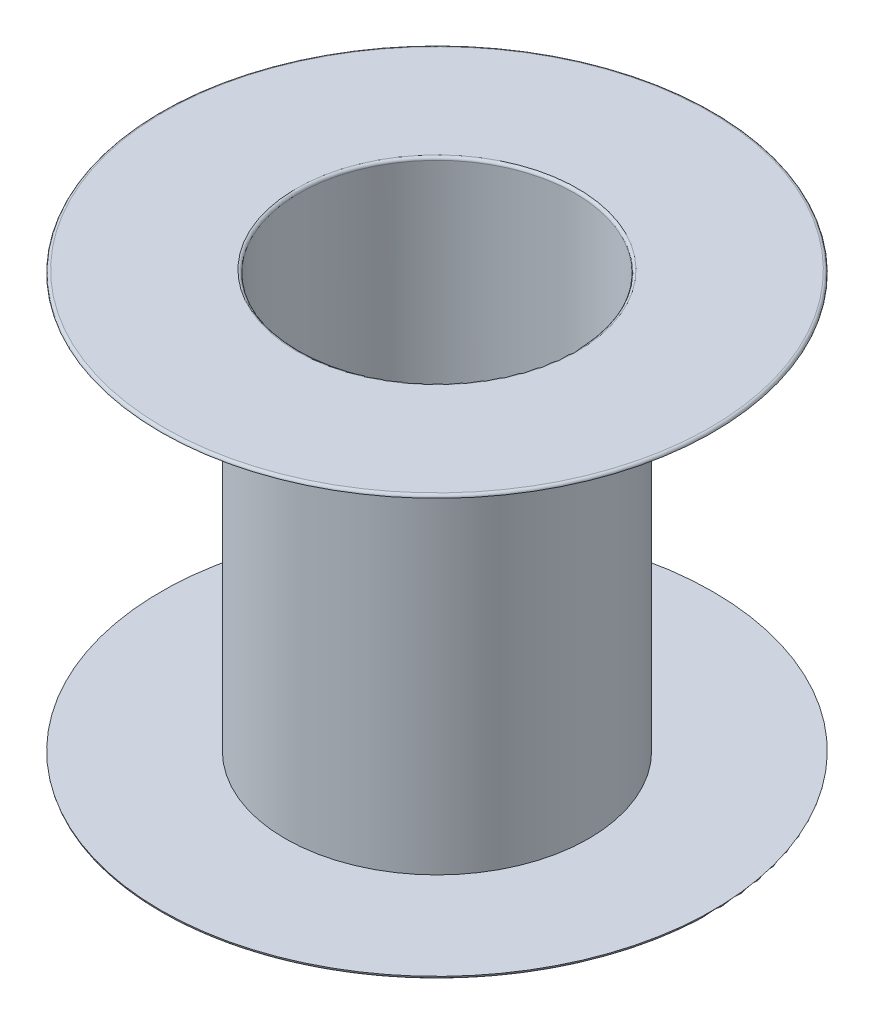
ISO-10303-21;
HEADER;
FILE_DESCRIPTION(('STEP AP214'),'2;1');
FILE_NAME('part.step','',(''),(''),'','','');
FILE_SCHEMA(('AUTOMOTIVE_DESIGN { 1 0 10303 214 1 1 1 1 }'));
ENDSEC;
DATA;
#1=APPLICATION_CONTEXT('core data for automotive mechanical design processes');
#2=APPLICATION_PROTOCOL_DEFINITION('international standard','automotive_design',2000,#1);
#3=PRODUCT_CONTEXT('',#1,'mechanical');
#4=PRODUCT('Part','Part','',(#3));
#5=PRODUCT_RELATED_PRODUCT_CATEGORY('part','',(#4));
#6=PRODUCT_DEFINITION_FORMATION('','',#4);
#7=PRODUCT_DEFINITION_CONTEXT('part definition',#1,'design');
#8=PRODUCT_DEFINITION('design','',#6,#7);
#9=PRODUCT_DEFINITION_SHAPE('','',#8);
#10=(LENGTH_UNIT() NAMED_UNIT(*) SI_UNIT(.MILLI.,.METRE.));
#11=(NAMED_UNIT(*) PLANE_ANGLE_UNIT() SI_UNIT($,.RADIAN.));
#12=(NAMED_UNIT(*) SI_UNIT($,.STERADIAN.) SOLID_ANGLE_UNIT());
#13=UNCERTAINTY_MEASURE_WITH_UNIT(LENGTH_MEASURE(1.E-05),#10,'distance_accuracy_value','');
#14=(GEOMETRIC_REPRESENTATION_CONTEXT(3) GLOBAL_UNCERTAINTY_ASSIGNED_CONTEXT((#13)) GLOBAL_UNIT_ASSIGNED_CONTEXT((#10,
#11,#12)) REPRESENTATION_CONTEXT('',''));
#15=CARTESIAN_POINT('',(0.,0.,0.));
#16=DIRECTION('',(0.,0.,1.));
#17=DIRECTION('',(1.,0.,0.));
#18=AXIS2_PLACEMENT_3D('',#15,#16,#17);
#19=CARTESIAN_POINT('',(0.,1.5,0.));
#20=DIRECTION('',(0.,-1.,0.));
#21=DIRECTION('',(0.,0.,-1.));
#22=AXIS2_PLACEMENT_3D('',#19,#20,#21);
#23=CYLINDRICAL_SURFACE('',#22,0.55);
#24=CARTESIAN_POINT('',(0.,1.5,0.));
#25=DIRECTION('',(0.,1.,0.));
#26=DIRECTION('',(0.,0.,1.));
#27=AXIS2_PLACEMENT_3D('',#24,#25,#26);
#28=CIRCLE('',#27,0.55);
#29=CARTESIAN_POINT('',(0.,1.5,0.55));
#30=VERTEX_POINT('',#29);
#31=EDGE_CURVE('E57',#30,#30,#28,.T.);
#32=ORIENTED_EDGE('',*,*,#31,.F.);
#33=EDGE_LOOP('',(#32));
#34=FACE_BOUND('',#33,.T.);
#35=CARTESIAN_POINT('',(0.,0.,0.));
#36=DIRECTION('',(0.,-1.,0.));
#37=DIRECTION('',(0.,0.,-1.));
#38=AXIS2_PLACEMENT_3D('',#35,#36,#37);
#39=CIRCLE('',#38,0.55);
#40=CARTESIAN_POINT('',(0.,0.,-0.55));
#41=VERTEX_POINT('',#40);
#42=EDGE_CURVE('E63',#41,#41,#39,.T.);
#43=ORIENTED_EDGE('',*,*,#42,.F.);
#44=EDGE_LOOP('',(#43));
#45=FACE_BOUND('',#44,.T.);
#46=ADVANCED_FACE('F31',(#34,#45),#23,.T.);
#47=CARTESIAN_POINT('',(0.,1.5,0.));
#48=DIRECTION('',(0.,-1.,0.));
#49=DIRECTION('',(0.,0.,-1.));
#50=AXIS2_PLACEMENT_3D('',#47,#48,#49);
#51=CYLINDRICAL_SURFACE('',#50,0.5);
#52=CARTESIAN_POINT('',(0.,0.,0.));
#53=DIRECTION('',(0.,-1.,0.));
#54=DIRECTION('',(0.,0.,-1.));
#55=AXIS2_PLACEMENT_3D('',#52,#53,#54);
#56=CIRCLE('',#55,0.5);
#57=CARTESIAN_POINT('',(0.,0.,-0.5));
#58=VERTEX_POINT('',#57);
#59=EDGE_CURVE('E10',#58,#58,#56,.T.);
#60=ORIENTED_EDGE('',*,*,#59,.T.);
#61=EDGE_LOOP('',(#60));
#62=FACE_BOUND('',#61,.T.);
#63=CARTESIAN_POINT('',(0.,1.5,0.));
#64=DIRECTION('',(0.,1.,0.));
#65=DIRECTION('',(0.,0.,1.));
#66=AXIS2_PLACEMENT_3D('',#63,#64,#65);
#67=CIRCLE('',#66,0.5);
#68=CARTESIAN_POINT('',(0.,1.5,0.5));
#69=VERTEX_POINT('',#68);
#70=EDGE_CURVE('E54',#69,#69,#67,.T.);
#71=ORIENTED_EDGE('',*,*,#70,.T.);
#72=EDGE_LOOP('',(#71));
#73=FACE_BOUND('',#72,.T.);
#74=ADVANCED_FACE('F85',(#62,#73),#51,.F.);
#75=CARTESIAN_POINT('',(0.,1.5,0.));
#76=DIRECTION('',(0.,1.,0.));
#77=DIRECTION('',(0.,0.,1.));
#78=AXIS2_PLACEMENT_3D('',#75,#76,#77);
#79=PLANE('',#78);
#80=CARTESIAN_POINT('',(0.,1.5,0.));
#81=DIRECTION('',(0.,1.,0.));
#82=DIRECTION('',(0.,0.,1.));
#83=AXIS2_PLACEMENT_3D('',#80,#81,#82);
#84=CIRCLE('',#83,1.);
#85=CARTESIAN_POINT('',(0.,1.5,1.));
#86=VERTEX_POINT('',#85);
#87=EDGE_CURVE('E60',#86,#86,#84,.T.);
#88=ORIENTED_EDGE('',*,*,#87,.F.);
#89=EDGE_LOOP('',(#88));
#90=FACE_BOUND('',#89,.T.);
#91=ORIENTED_EDGE('',*,*,#31,.T.);
#92=EDGE_LOOP('',(#91));
#93=FACE_BOUND('',#92,.T.);
#94=ADVANCED_FACE('F91',(#90,#93),#79,.F.);
#95=CARTESIAN_POINT('',(0.,1.51,0.));
#96=DIRECTION('',(0.,1.,0.));
#97=DIRECTION('',(0.,0.,1.));
#98=AXIS2_PLACEMENT_3D('',#95,#96,#97);
#99=PLANE('',#98);
#100=CARTESIAN_POINT('',(0.,1.51,0.));
#101=DIRECTION('',(0.,1.,0.));
#102=DIRECTION('',(0.,0.,1.));
#103=AXIS2_PLACEMENT_3D('',#100,#101,#102);
#104=CIRCLE('',#103,0.51);
#105=CARTESIAN_POINT('',(0.,1.51,0.51));
#106=VERTEX_POINT('',#105);
#107=EDGE_CURVE('E46',#106,#106,#104,.F.);
#108=ORIENTED_EDGE('',*,*,#107,.T.);
#109=EDGE_LOOP('',(#108));
#110=FACE_BOUND('',#109,.T.);
#111=CARTESIAN_POINT('',(0.,1.51,0.));
#112=DIRECTION('',(0.,1.,0.));
#113=DIRECTION('',(0.,0.,1.));
#114=AXIS2_PLACEMENT_3D('',#111,#112,#113);
#115=CIRCLE('',#114,0.99);
#116=CARTESIAN_POINT('',(0.,1.51,0.99));
#117=VERTEX_POINT('',#116);
#118=EDGE_CURVE('E51',#117,#117,#115,.T.);
#119=ORIENTED_EDGE('',*,*,#118,.T.);
#120=EDGE_LOOP('',(#119));
#121=FACE_BOUND('',#120,.T.);
#122=ADVANCED_FACE('F100',(#110,#121),#99,.T.);
#123=CARTESIAN_POINT('',(0.,1.5,0.));
#124=DIRECTION('',(0.,1.,0.));
#125=DIRECTION('',(0.,0.,1.));
#126=AXIS2_PLACEMENT_3D('',#123,#124,#125);
#127=TOROIDAL_SURFACE('',#126,0.51,0.01);
#128=ORIENTED_EDGE('',*,*,#107,.F.);
#129=EDGE_LOOP('',(#128));
#130=FACE_BOUND('',#129,.T.);
#131=ORIENTED_EDGE('',*,*,#70,.F.);
#132=EDGE_LOOP('',(#131));
#133=FACE_BOUND('',#132,.T.);
#134=ADVANCED_FACE('F97',(#130,#133),#127,.T.);
#135=CARTESIAN_POINT('',(0.,1.5,0.));
#136=DIRECTION('',(0.,1.,0.));
#137=DIRECTION('',(0.,0.,1.));
#138=AXIS2_PLACEMENT_3D('',#135,#136,#137);
#139=TOROIDAL_SURFACE('',#138,0.99,0.01);
#140=ORIENTED_EDGE('',*,*,#87,.T.);
#141=EDGE_LOOP('',(#140));
#142=FACE_BOUND('',#141,.T.);
#143=ORIENTED_EDGE('',*,*,#118,.F.);
#144=EDGE_LOOP('',(#143));
#145=FACE_BOUND('',#144,.T.);
#146=ADVANCED_FACE('F99',(#142,#145),#139,.T.);
#147=CARTESIAN_POINT('',(0.,0.,0.));
#148=DIRECTION('',(0.,-1.,0.));
#149=DIRECTION('',(0.,0.,1.));
#150=AXIS2_PLACEMENT_3D('',#147,#148,#149);
#151=PLANE('',#150);
#152=CARTESIAN_POINT('',(0.,0.,0.));
#153=DIRECTION('',(0.,1.,0.));
#154=DIRECTION('',(0.,0.,1.));
#155=AXIS2_PLACEMENT_3D('',#152,#153,#154);
#156=CIRCLE('',#155,1.);
#157=CARTESIAN_POINT('',(0.,0.,1.));
#158=VERTEX_POINT('',#157);
#159=EDGE_CURVE('E66',#158,#158,#156,.T.);
#160=ORIENTED_EDGE('',*,*,#159,.T.);
#161=EDGE_LOOP('',(#160));
#162=FACE_BOUND('',#161,.T.);
#163=ORIENTED_EDGE('',*,*,#42,.T.);
#164=EDGE_LOOP('',(#163));
#165=FACE_BOUND('',#164,.T.);
#166=ADVANCED_FACE('F70',(#162,#165),#151,.F.);
#167=CARTESIAN_POINT('',(0.,-0.01,0.));
#168=DIRECTION('',(0.,-1.,0.));
#169=DIRECTION('',(0.,0.,1.));
#170=AXIS2_PLACEMENT_3D('',#167,#168,#169);
#171=PLANE('',#170);
#172=CARTESIAN_POINT('',(0.,-0.01,0.));
#173=DIRECTION('',(0.,-1.,0.));
#174=DIRECTION('',(0.,0.,-1.));
#175=AXIS2_PLACEMENT_3D('',#172,#173,#174);
#176=CIRCLE('',#175,0.99);
#177=CARTESIAN_POINT('',(0.,-0.01,-0.99));
#178=VERTEX_POINT('',#177);
#179=EDGE_CURVE('E38',#178,#178,#176,.T.);
#180=ORIENTED_EDGE('',*,*,#179,.T.);
#181=EDGE_LOOP('',(#180));
#182=FACE_BOUND('',#181,.T.);
#183=CARTESIAN_POINT('',(0.,-0.01,0.));
#184=DIRECTION('',(0.,-1.,0.));
#185=DIRECTION('',(0.,0.,-1.));
#186=AXIS2_PLACEMENT_3D('',#183,#184,#185);
#187=CIRCLE('',#186,0.51);
#188=CARTESIAN_POINT('',(0.,-0.01,-0.51));
#189=VERTEX_POINT('',#188);
#190=EDGE_CURVE('E42',#189,#189,#187,.F.);
#191=ORIENTED_EDGE('',*,*,#190,.T.);
#192=EDGE_LOOP('',(#191));
#193=FACE_BOUND('',#192,.T.);
#194=ADVANCED_FACE('F75',(#182,#193),#171,.T.);
#195=CARTESIAN_POINT('',(0.,0.,0.));
#196=DIRECTION('',(0.,-1.,0.));
#197=DIRECTION('',(0.,0.,-1.));
#198=AXIS2_PLACEMENT_3D('',#195,#196,#197);
#199=TOROIDAL_SURFACE('',#198,0.99,0.01);
#200=ORIENTED_EDGE('',*,*,#179,.F.);
#201=EDGE_LOOP('',(#200));
#202=FACE_BOUND('',#201,.T.);
#203=ORIENTED_EDGE('',*,*,#159,.F.);
#204=EDGE_LOOP('',(#203));
#205=FACE_BOUND('',#204,.T.);
#206=ADVANCED_FACE('F73',(#202,#205),#199,.T.);
#207=CARTESIAN_POINT('',(0.,0.,0.));
#208=DIRECTION('',(0.,-1.,0.));
#209=DIRECTION('',(0.,0.,-1.));
#210=AXIS2_PLACEMENT_3D('',#207,#208,#209);
#211=TOROIDAL_SURFACE('',#210,0.51,0.01);
#212=ORIENTED_EDGE('',*,*,#59,.F.);
#213=EDGE_LOOP('',(#212));
#214=FACE_BOUND('',#213,.T.);
#215=ORIENTED_EDGE('',*,*,#190,.F.);
#216=EDGE_LOOP('',(#215));
#217=FACE_BOUND('',#216,.T.);
#218=ADVANCED_FACE('F33',(#214,#217),#211,.T.);
#219=CLOSED_SHELL('',(#46,#74,#94,#122,#134,#146,#166,#194,#206,#218));
#220=MANIFOLD_SOLID_BREP('B2',#219);
#221=ADVANCED_BREP_SHAPE_REPRESENTATION('',(#18,#220),#14);
#222=SHAPE_DEFINITION_REPRESENTATION(#9,#221);
ENDSEC;
END-ISO-10303-21;
